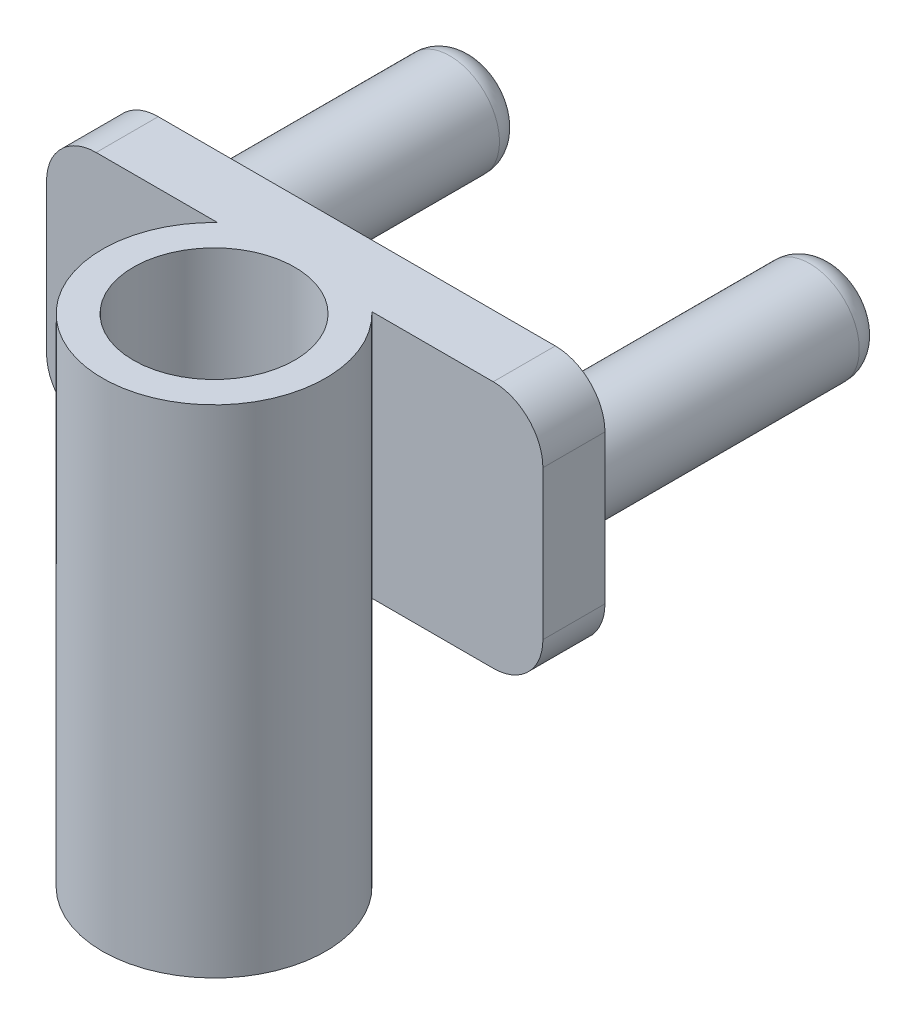
ISO-10303-21;
HEADER;
FILE_DESCRIPTION(('STEP AP214'),'2;1');
FILE_NAME('part.step','',(''),(''),'','','');
FILE_SCHEMA(('AUTOMOTIVE_DESIGN { 1 0 10303 214 1 1 1 1 }'));
ENDSEC;
DATA;
#1=APPLICATION_CONTEXT('core data for automotive mechanical design processes');
#2=APPLICATION_PROTOCOL_DEFINITION('international standard','automotive_design',2000,#1);
#3=PRODUCT_CONTEXT('',#1,'mechanical');
#4=PRODUCT('Part','Part','',(#3));
#5=PRODUCT_RELATED_PRODUCT_CATEGORY('part','',(#4));
#6=PRODUCT_DEFINITION_FORMATION('','',#4);
#7=PRODUCT_DEFINITION_CONTEXT('part definition',#1,'design');
#8=PRODUCT_DEFINITION('design','',#6,#7);
#9=PRODUCT_DEFINITION_SHAPE('','',#8);
#10=(LENGTH_UNIT() NAMED_UNIT(*) SI_UNIT(.MILLI.,.METRE.));
#11=(NAMED_UNIT(*) PLANE_ANGLE_UNIT() SI_UNIT($,.RADIAN.));
#12=(NAMED_UNIT(*) SI_UNIT($,.STERADIAN.) SOLID_ANGLE_UNIT());
#13=UNCERTAINTY_MEASURE_WITH_UNIT(LENGTH_MEASURE(1.E-05),#10,'distance_accuracy_value','');
#14=(GEOMETRIC_REPRESENTATION_CONTEXT(3) GLOBAL_UNCERTAINTY_ASSIGNED_CONTEXT((#13)) GLOBAL_UNIT_ASSIGNED_CONTEXT((#10,
#11,#12)) REPRESENTATION_CONTEXT('',''));
#15=CARTESIAN_POINT('',(0.,0.,0.));
#16=DIRECTION('',(0.,0.,1.));
#17=DIRECTION('',(1.,0.,0.));
#18=AXIS2_PLACEMENT_3D('',#15,#16,#17);
#19=CARTESIAN_POINT('',(0.,20.,0.));
#20=DIRECTION('',(0.,-1.,0.));
#21=DIRECTION('',(0.,0.,-1.));
#22=AXIS2_PLACEMENT_3D('',#19,#20,#21);
#23=CYLINDRICAL_SURFACE('',#22,4.5);
#24=CARTESIAN_POINT('',(0.,0.,0.));
#25=DIRECTION('',(0.,1.,0.));
#26=DIRECTION('',(0.,0.,1.));
#27=AXIS2_PLACEMENT_3D('',#24,#25,#26);
#28=CIRCLE('',#27,4.5);
#29=CARTESIAN_POINT('',(0.,0.,4.5));
#30=VERTEX_POINT('',#29);
#31=EDGE_CURVE('E137',#30,#30,#28,.T.);
#32=ORIENTED_EDGE('',*,*,#31,.T.);
#33=EDGE_LOOP('',(#32));
#34=FACE_BOUND('',#33,.T.);
#35=DIRECTION('',(0.,-1.,0.));
#36=VECTOR('',#35,1.);
#37=CARTESIAN_POINT('',(3.11247489949718,20.,-3.25));
#38=LINE('',#37,#36);
#39=CARTESIAN_POINT('',(3.11247489949718,20.,-3.25));
#40=VERTEX_POINT('',#39);
#41=CARTESIAN_POINT('',(3.11247489949718,10.,-3.25));
#42=VERTEX_POINT('',#41);
#43=EDGE_CURVE('E135',#40,#42,#38,.T.);
#44=ORIENTED_EDGE('',*,*,#43,.F.);
#45=CARTESIAN_POINT('',(0.,20.,0.));
#46=DIRECTION('',(0.,1.,0.));
#47=DIRECTION('',(0.,0.,1.));
#48=AXIS2_PLACEMENT_3D('',#45,#46,#47);
#49=CIRCLE('',#48,4.5);
#50=CARTESIAN_POINT('',(-3.11247489949718,20.,-3.25));
#51=VERTEX_POINT('',#50);
#52=EDGE_CURVE('E120',#51,#40,#49,.T.);
#53=ORIENTED_EDGE('',*,*,#52,.F.);
#54=DIRECTION('',(0.,-1.,0.));
#55=VECTOR('',#54,1.);
#56=CARTESIAN_POINT('',(-3.11247489949718,20.,-3.25));
#57=LINE('',#56,#55);
#58=CARTESIAN_POINT('',(-3.11247489949718,10.,-3.25));
#59=VERTEX_POINT('',#58);
#60=EDGE_CURVE('E132',#59,#51,#57,.F.);
#61=ORIENTED_EDGE('',*,*,#60,.F.);
#62=CARTESIAN_POINT('',(0.,10.,0.));
#63=DIRECTION('',(0.,1.,0.));
#64=DIRECTION('',(0.,0.,1.));
#65=AXIS2_PLACEMENT_3D('',#62,#63,#64);
#66=CIRCLE('',#65,4.5);
#67=EDGE_CURVE('E144',#42,#59,#66,.T.);
#68=ORIENTED_EDGE('',*,*,#67,.F.);
#69=EDGE_LOOP('',(#44,#53,#61,#68));
#70=FACE_BOUND('',#69,.T.);
#71=ADVANCED_FACE('F36',(#34,#70),#23,.T.);
#72=CARTESIAN_POINT('',(0.,20.,0.));
#73=DIRECTION('',(0.,1.,0.));
#74=DIRECTION('',(0.,0.,1.));
#75=AXIS2_PLACEMENT_3D('',#72,#73,#74);
#76=PLANE('',#75);
#77=CARTESIAN_POINT('',(0.,20.,0.));
#78=DIRECTION('',(0.,1.,0.));
#79=DIRECTION('',(0.,0.,1.));
#80=AXIS2_PLACEMENT_3D('',#77,#78,#79);
#81=CIRCLE('',#80,3.25);
#82=CARTESIAN_POINT('',(0.,20.,3.25));
#83=VERTEX_POINT('',#82);
#84=EDGE_CURVE('E153',#83,#83,#81,.T.);
#85=ORIENTED_EDGE('',*,*,#84,.F.);
#86=EDGE_LOOP('',(#85));
#87=FACE_BOUND('',#86,.T.);
#88=DIRECTION('',(1.,0.,0.));
#89=VECTOR('',#88,1.);
#90=CARTESIAN_POINT('',(-10.,20.,-5.75));
#91=LINE('',#90,#89);
#92=CARTESIAN_POINT('',(-8.,20.,-5.75));
#93=VERTEX_POINT('',#92);
#94=CARTESIAN_POINT('',(8.,20.,-5.75));
#95=VERTEX_POINT('',#94);
#96=EDGE_CURVE('E258',#93,#95,#91,.T.);
#97=ORIENTED_EDGE('',*,*,#96,.F.);
#98=DIRECTION('',(0.,0.,-1.));
#99=VECTOR('',#98,1.);
#100=CARTESIAN_POINT('',(-8.,20.,-3.25));
#101=LINE('',#100,#99);
#102=CARTESIAN_POINT('',(-8.,20.,-3.25));
#103=VERTEX_POINT('',#102);
#104=EDGE_CURVE('E123',#93,#103,#101,.F.);
#105=ORIENTED_EDGE('',*,*,#104,.T.);
#106=DIRECTION('',(1.,0.,0.));
#107=VECTOR('',#106,1.);
#108=CARTESIAN_POINT('',(-10.,20.,-3.25));
#109=LINE('',#108,#107);
#110=EDGE_CURVE('E115',#103,#51,#109,.T.);
#111=ORIENTED_EDGE('',*,*,#110,.T.);
#112=ORIENTED_EDGE('',*,*,#52,.T.);
#113=CARTESIAN_POINT('',(8.,20.,-3.25));
#114=VERTEX_POINT('',#113);
#115=EDGE_CURVE('E128',#40,#114,#109,.T.);
#116=ORIENTED_EDGE('',*,*,#115,.T.);
#117=DIRECTION('',(0.,0.,-1.));
#118=VECTOR('',#117,1.);
#119=CARTESIAN_POINT('',(8.,20.,0.));
#120=LINE('',#119,#118);
#121=EDGE_CURVE('E181',#114,#95,#120,.T.);
#122=ORIENTED_EDGE('',*,*,#121,.T.);
#123=EDGE_LOOP('',(#97,#105,#111,#112,#116,#122));
#124=FACE_BOUND('',#123,.T.);
#125=ADVANCED_FACE('F118',(#87,#124),#76,.T.);
#126=CARTESIAN_POINT('',(0.,0.,0.));
#127=DIRECTION('',(0.,1.,0.));
#128=DIRECTION('',(0.,0.,1.));
#129=AXIS2_PLACEMENT_3D('',#126,#127,#128);
#130=PLANE('',#129);
#131=ORIENTED_EDGE('',*,*,#31,.F.);
#132=EDGE_LOOP('',(#131));
#133=FACE_BOUND('',#132,.T.);
#134=CARTESIAN_POINT('',(0.,0.,0.));
#135=DIRECTION('',(0.,1.,0.));
#136=DIRECTION('',(0.,0.,1.));
#137=AXIS2_PLACEMENT_3D('',#134,#135,#136);
#138=CIRCLE('',#137,3.25);
#139=CARTESIAN_POINT('',(0.,0.,3.25));
#140=VERTEX_POINT('',#139);
#141=EDGE_CURVE('E152',#140,#140,#138,.T.);
#142=ORIENTED_EDGE('',*,*,#141,.T.);
#143=EDGE_LOOP('',(#142));
#144=FACE_BOUND('',#143,.T.);
#145=ADVANCED_FACE('F217',(#133,#144),#130,.F.);
#146=CARTESIAN_POINT('',(0.,20.,0.));
#147=DIRECTION('',(0.,-1.,0.));
#148=DIRECTION('',(0.,0.,-1.));
#149=AXIS2_PLACEMENT_3D('',#146,#147,#148);
#150=CYLINDRICAL_SURFACE('',#149,3.25);
#151=ORIENTED_EDGE('',*,*,#84,.T.);
#152=EDGE_LOOP('',(#151));
#153=FACE_BOUND('',#152,.T.);
#154=ORIENTED_EDGE('',*,*,#141,.F.);
#155=EDGE_LOOP('',(#154));
#156=FACE_BOUND('',#155,.T.);
#157=ADVANCED_FACE('F296',(#153,#156),#150,.F.);
#158=CARTESIAN_POINT('',(0.,0.,-3.25));
#159=DIRECTION('',(0.,0.,-1.));
#160=DIRECTION('',(-1.,0.,0.));
#161=AXIS2_PLACEMENT_3D('',#158,#159,#160);
#162=PLANE('',#161);
#163=DIRECTION('',(1.,0.,0.));
#164=VECTOR('',#163,1.);
#165=CARTESIAN_POINT('',(-10.,10.,-3.25));
#166=LINE('',#165,#164);
#167=CARTESIAN_POINT('',(8.,10.,-3.25));
#168=VERTEX_POINT('',#167);
#169=EDGE_CURVE('E261',#42,#168,#166,.T.);
#170=ORIENTED_EDGE('',*,*,#169,.T.);
#171=CARTESIAN_POINT('',(8.,12.,-3.25));
#172=DIRECTION('',(0.,0.,-1.));
#173=DIRECTION('',(-1.,0.,0.));
#174=AXIS2_PLACEMENT_3D('',#171,#172,#173);
#175=CIRCLE('',#174,2.);
#176=CARTESIAN_POINT('',(10.,12.,-3.25));
#177=VERTEX_POINT('',#176);
#178=EDGE_CURVE('E51',#168,#177,#175,.F.);
#179=ORIENTED_EDGE('',*,*,#178,.T.);
#180=DIRECTION('',(0.,-1.,0.));
#181=VECTOR('',#180,1.);
#182=CARTESIAN_POINT('',(10.,20.,-3.25));
#183=LINE('',#182,#181);
#184=CARTESIAN_POINT('',(10.,18.,-3.25));
#185=VERTEX_POINT('',#184);
#186=EDGE_CURVE('E247',#185,#177,#183,.T.);
#187=ORIENTED_EDGE('',*,*,#186,.F.);
#188=CARTESIAN_POINT('',(8.,18.,-3.25));
#189=DIRECTION('',(0.,0.,-1.));
#190=DIRECTION('',(-1.,0.,0.));
#191=AXIS2_PLACEMENT_3D('',#188,#189,#190);
#192=CIRCLE('',#191,2.);
#193=EDGE_CURVE('E189',#185,#114,#192,.F.);
#194=ORIENTED_EDGE('',*,*,#193,.T.);
#195=ORIENTED_EDGE('',*,*,#115,.F.);
#196=ORIENTED_EDGE('',*,*,#43,.T.);
#197=EDGE_LOOP('',(#170,#179,#187,#194,#195,#196));
#198=FACE_BOUND('',#197,.T.);
#199=ADVANCED_FACE('F246',(#198),#162,.F.);
#200=DIRECTION('',(0.,-1.,0.));
#201=VECTOR('',#200,1.);
#202=CARTESIAN_POINT('',(-10.,20.,-3.25));
#203=LINE('',#202,#201);
#204=CARTESIAN_POINT('',(-10.,18.,-3.25));
#205=VERTEX_POINT('',#204);
#206=CARTESIAN_POINT('',(-10.,12.,-3.25));
#207=VERTEX_POINT('',#206);
#208=EDGE_CURVE('E127',#205,#207,#203,.T.);
#209=ORIENTED_EDGE('',*,*,#208,.T.);
#210=CARTESIAN_POINT('',(-8.,12.,-3.25));
#211=DIRECTION('',(0.,0.,-1.));
#212=DIRECTION('',(-1.,0.,0.));
#213=AXIS2_PLACEMENT_3D('',#210,#211,#212);
#214=CIRCLE('',#213,2.);
#215=CARTESIAN_POINT('',(-8.,10.,-3.25));
#216=VERTEX_POINT('',#215);
#217=EDGE_CURVE('E179',#207,#216,#214,.F.);
#218=ORIENTED_EDGE('',*,*,#217,.T.);
#219=EDGE_CURVE('E142',#216,#59,#166,.T.);
#220=ORIENTED_EDGE('',*,*,#219,.T.);
#221=ORIENTED_EDGE('',*,*,#60,.T.);
#222=ORIENTED_EDGE('',*,*,#110,.F.);
#223=CARTESIAN_POINT('',(-8.,18.,-3.25));
#224=DIRECTION('',(0.,0.,-1.));
#225=DIRECTION('',(-1.,0.,0.));
#226=AXIS2_PLACEMENT_3D('',#223,#224,#225);
#227=CIRCLE('',#226,2.);
#228=EDGE_CURVE('E177',#103,#205,#227,.F.);
#229=ORIENTED_EDGE('',*,*,#228,.T.);
#230=EDGE_LOOP('',(#209,#218,#220,#221,#222,#229));
#231=FACE_BOUND('',#230,.T.);
#232=ADVANCED_FACE('F140',(#231),#162,.F.);
#233=CARTESIAN_POINT('',(-10.,10.,-3.25));
#234=DIRECTION('',(0.,1.,0.));
#235=DIRECTION('',(0.,0.,1.));
#236=AXIS2_PLACEMENT_3D('',#233,#234,#235);
#237=PLANE('',#236);
#238=ORIENTED_EDGE('',*,*,#219,.F.);
#239=DIRECTION('',(0.,0.,-1.));
#240=VECTOR('',#239,1.);
#241=CARTESIAN_POINT('',(-8.,10.,-3.25));
#242=LINE('',#241,#240);
#243=CARTESIAN_POINT('',(-8.,10.,-5.75));
#244=VERTEX_POINT('',#243);
#245=EDGE_CURVE('E161',#216,#244,#242,.T.);
#246=ORIENTED_EDGE('',*,*,#245,.T.);
#247=DIRECTION('',(1.,0.,0.));
#248=VECTOR('',#247,1.);
#249=CARTESIAN_POINT('',(-10.,10.,-5.75));
#250=LINE('',#249,#248);
#251=CARTESIAN_POINT('',(8.,10.,-5.75));
#252=VERTEX_POINT('',#251);
#253=EDGE_CURVE('E252',#244,#252,#250,.T.);
#254=ORIENTED_EDGE('',*,*,#253,.T.);
#255=DIRECTION('',(0.,0.,-1.));
#256=VECTOR('',#255,1.);
#257=CARTESIAN_POINT('',(8.,10.,-3.25));
#258=LINE('',#257,#256);
#259=EDGE_CURVE('E136',#252,#168,#258,.F.);
#260=ORIENTED_EDGE('',*,*,#259,.T.);
#261=ORIENTED_EDGE('',*,*,#169,.F.);
#262=ORIENTED_EDGE('',*,*,#67,.T.);
#263=EDGE_LOOP('',(#238,#246,#254,#260,#261,#262));
#264=FACE_BOUND('',#263,.T.);
#265=ADVANCED_FACE('F283',(#264),#237,.F.);
#266=CARTESIAN_POINT('',(10.,20.,-3.25));
#267=DIRECTION('',(1.,0.,0.));
#268=DIRECTION('',(0.,0.,-1.));
#269=AXIS2_PLACEMENT_3D('',#266,#267,#268);
#270=PLANE('',#269);
#271=ORIENTED_EDGE('',*,*,#186,.T.);
#272=DIRECTION('',(0.,0.,-1.));
#273=VECTOR('',#272,1.);
#274=CARTESIAN_POINT('',(10.,12.,-5.75));
#275=LINE('',#274,#273);
#276=CARTESIAN_POINT('',(10.,12.,-5.75));
#277=VERTEX_POINT('',#276);
#278=EDGE_CURVE('E186',#177,#277,#275,.T.);
#279=ORIENTED_EDGE('',*,*,#278,.T.);
#280=DIRECTION('',(0.,-1.,0.));
#281=VECTOR('',#280,1.);
#282=CARTESIAN_POINT('',(10.,20.,-5.75));
#283=LINE('',#282,#281);
#284=CARTESIAN_POINT('',(10.,18.,-5.75));
#285=VERTEX_POINT('',#284);
#286=EDGE_CURVE('E255',#285,#277,#283,.T.);
#287=ORIENTED_EDGE('',*,*,#286,.F.);
#288=DIRECTION('',(0.,0.,-1.));
#289=VECTOR('',#288,1.);
#290=CARTESIAN_POINT('',(10.,18.,-3.25));
#291=LINE('',#290,#289);
#292=EDGE_CURVE('E58',#285,#185,#291,.F.);
#293=ORIENTED_EDGE('',*,*,#292,.T.);
#294=EDGE_LOOP('',(#271,#279,#287,#293));
#295=FACE_BOUND('',#294,.T.);
#296=ADVANCED_FACE('F286',(#295),#270,.T.);
#297=CARTESIAN_POINT('',(-10.,20.,-3.25));
#298=DIRECTION('',(1.,0.,0.));
#299=DIRECTION('',(0.,0.,-1.));
#300=AXIS2_PLACEMENT_3D('',#297,#298,#299);
#301=PLANE('',#300);
#302=DIRECTION('',(0.,-1.,0.));
#303=VECTOR('',#302,1.);
#304=CARTESIAN_POINT('',(-10.,20.,-5.75));
#305=LINE('',#304,#303);
#306=CARTESIAN_POINT('',(-10.,18.,-5.75));
#307=VERTEX_POINT('',#306);
#308=CARTESIAN_POINT('',(-10.,12.,-5.75));
#309=VERTEX_POINT('',#308);
#310=EDGE_CURVE('E148',#307,#309,#305,.T.);
#311=ORIENTED_EDGE('',*,*,#310,.T.);
#312=DIRECTION('',(0.,0.,-1.));
#313=VECTOR('',#312,1.);
#314=CARTESIAN_POINT('',(-10.,12.,-3.25));
#315=LINE('',#314,#313);
#316=EDGE_CURVE('E175',#309,#207,#315,.F.);
#317=ORIENTED_EDGE('',*,*,#316,.T.);
#318=ORIENTED_EDGE('',*,*,#208,.F.);
#319=DIRECTION('',(0.,0.,-1.));
#320=VECTOR('',#319,1.);
#321=CARTESIAN_POINT('',(-10.,18.,-5.75));
#322=LINE('',#321,#320);
#323=EDGE_CURVE('E172',#205,#307,#322,.T.);
#324=ORIENTED_EDGE('',*,*,#323,.T.);
#325=EDGE_LOOP('',(#311,#317,#318,#324));
#326=FACE_BOUND('',#325,.T.);
#327=ADVANCED_FACE('F277',(#326),#301,.F.);
#328=CARTESIAN_POINT('',(0.,0.,-5.75));
#329=DIRECTION('',(0.,0.,-1.));
#330=DIRECTION('',(-1.,0.,0.));
#331=AXIS2_PLACEMENT_3D('',#328,#329,#330);
#332=PLANE('',#331);
#333=CARTESIAN_POINT('',(-7.25,15.,-5.75));
#334=DIRECTION('',(0.,0.,-1.));
#335=DIRECTION('',(-1.,0.,0.));
#336=AXIS2_PLACEMENT_3D('',#333,#334,#335);
#337=CIRCLE('',#336,2.);
#338=CARTESIAN_POINT('',(-9.25,15.,-5.75));
#339=VERTEX_POINT('',#338);
#340=EDGE_CURVE('E269',#339,#339,#337,.T.);
#341=ORIENTED_EDGE('',*,*,#340,.F.);
#342=EDGE_LOOP('',(#341));
#343=FACE_BOUND('',#342,.T.);
#344=CARTESIAN_POINT('',(7.25,15.,-5.75));
#345=DIRECTION('',(0.,0.,-1.));
#346=DIRECTION('',(-1.,0.,0.));
#347=AXIS2_PLACEMENT_3D('',#344,#345,#346);
#348=CIRCLE('',#347,2.);
#349=CARTESIAN_POINT('',(5.25,15.,-5.75));
#350=VERTEX_POINT('',#349);
#351=EDGE_CURVE('E256',#350,#350,#348,.T.);
#352=ORIENTED_EDGE('',*,*,#351,.F.);
#353=EDGE_LOOP('',(#352));
#354=FACE_BOUND('',#353,.T.);
#355=ORIENTED_EDGE('',*,*,#253,.F.);
#356=CARTESIAN_POINT('',(-8.,12.,-5.75));
#357=DIRECTION('',(0.,0.,-1.));
#358=DIRECTION('',(-1.,0.,0.));
#359=AXIS2_PLACEMENT_3D('',#356,#357,#358);
#360=CIRCLE('',#359,2.);
#361=EDGE_CURVE('E170',#244,#309,#360,.T.);
#362=ORIENTED_EDGE('',*,*,#361,.T.);
#363=ORIENTED_EDGE('',*,*,#310,.F.);
#364=CARTESIAN_POINT('',(-8.,18.,-5.75));
#365=DIRECTION('',(0.,0.,-1.));
#366=DIRECTION('',(-1.,0.,0.));
#367=AXIS2_PLACEMENT_3D('',#364,#365,#366);
#368=CIRCLE('',#367,2.);
#369=EDGE_CURVE('E168',#307,#93,#368,.T.);
#370=ORIENTED_EDGE('',*,*,#369,.T.);
#371=ORIENTED_EDGE('',*,*,#96,.T.);
#372=CARTESIAN_POINT('',(8.,18.,-5.75));
#373=DIRECTION('',(0.,0.,-1.));
#374=DIRECTION('',(-1.,0.,0.));
#375=AXIS2_PLACEMENT_3D('',#372,#373,#374);
#376=CIRCLE('',#375,2.);
#377=EDGE_CURVE('E164',#95,#285,#376,.T.);
#378=ORIENTED_EDGE('',*,*,#377,.T.);
#379=ORIENTED_EDGE('',*,*,#286,.T.);
#380=CARTESIAN_POINT('',(8.,12.,-5.75));
#381=DIRECTION('',(0.,0.,-1.));
#382=DIRECTION('',(-1.,0.,0.));
#383=AXIS2_PLACEMENT_3D('',#380,#381,#382);
#384=CIRCLE('',#383,2.);
#385=EDGE_CURVE('E166',#277,#252,#384,.T.);
#386=ORIENTED_EDGE('',*,*,#385,.T.);
#387=EDGE_LOOP('',(#355,#362,#363,#370,#371,#378,#379,#386));
#388=FACE_BOUND('',#387,.T.);
#389=ADVANCED_FACE('F226',(#343,#354,#388),#332,.T.);
#390=CARTESIAN_POINT('',(-8.,12.,-3.25));
#391=DIRECTION('',(0.,0.,-1.));
#392=DIRECTION('',(-1.,0.,0.));
#393=AXIS2_PLACEMENT_3D('',#390,#391,#392);
#394=CYLINDRICAL_SURFACE('',#393,2.);
#395=ORIENTED_EDGE('',*,*,#217,.F.);
#396=ORIENTED_EDGE('',*,*,#316,.F.);
#397=ORIENTED_EDGE('',*,*,#361,.F.);
#398=ORIENTED_EDGE('',*,*,#245,.F.);
#399=EDGE_LOOP('',(#395,#396,#397,#398));
#400=FACE_BOUND('',#399,.T.);
#401=ADVANCED_FACE('F222',(#400),#394,.T.);
#402=CARTESIAN_POINT('',(-8.,18.,-3.25));
#403=DIRECTION('',(0.,0.,1.));
#404=DIRECTION('',(1.,0.,0.));
#405=AXIS2_PLACEMENT_3D('',#402,#403,#404);
#406=CYLINDRICAL_SURFACE('',#405,2.);
#407=ORIENTED_EDGE('',*,*,#228,.F.);
#408=ORIENTED_EDGE('',*,*,#104,.F.);
#409=ORIENTED_EDGE('',*,*,#369,.F.);
#410=ORIENTED_EDGE('',*,*,#323,.F.);
#411=EDGE_LOOP('',(#407,#408,#409,#410));
#412=FACE_BOUND('',#411,.T.);
#413=ADVANCED_FACE('F225',(#412),#406,.T.);
#414=CARTESIAN_POINT('',(8.,12.,-3.25));
#415=DIRECTION('',(0.,0.,1.));
#416=DIRECTION('',(1.,0.,0.));
#417=AXIS2_PLACEMENT_3D('',#414,#415,#416);
#418=CYLINDRICAL_SURFACE('',#417,2.);
#419=ORIENTED_EDGE('',*,*,#178,.F.);
#420=ORIENTED_EDGE('',*,*,#259,.F.);
#421=ORIENTED_EDGE('',*,*,#385,.F.);
#422=ORIENTED_EDGE('',*,*,#278,.F.);
#423=EDGE_LOOP('',(#419,#420,#421,#422));
#424=FACE_BOUND('',#423,.T.);
#425=ADVANCED_FACE('F230',(#424),#418,.T.);
#426=CARTESIAN_POINT('',(8.,18.,0.));
#427=DIRECTION('',(0.,0.,-1.));
#428=DIRECTION('',(-1.,0.,0.));
#429=AXIS2_PLACEMENT_3D('',#426,#427,#428);
#430=CYLINDRICAL_SURFACE('',#429,2.);
#431=ORIENTED_EDGE('',*,*,#193,.F.);
#432=ORIENTED_EDGE('',*,*,#292,.F.);
#433=ORIENTED_EDGE('',*,*,#377,.F.);
#434=ORIENTED_EDGE('',*,*,#121,.F.);
#435=EDGE_LOOP('',(#431,#432,#433,#434));
#436=FACE_BOUND('',#435,.T.);
#437=ADVANCED_FACE('F234',(#436),#430,.T.);
#438=CARTESIAN_POINT('',(7.25,15.,-17.75));
#439=DIRECTION('',(0.,0.,1.));
#440=DIRECTION('',(1.,0.,0.));
#441=AXIS2_PLACEMENT_3D('',#438,#439,#440);
#442=CYLINDRICAL_SURFACE('',#441,2.);
#443=CARTESIAN_POINT('',(7.25,15.,-16.75));
#444=DIRECTION('',(0.,0.,-1.));
#445=DIRECTION('',(-1.,0.,0.));
#446=AXIS2_PLACEMENT_3D('',#443,#444,#445);
#447=CIRCLE('',#446,2.);
#448=CARTESIAN_POINT('',(5.25,15.,-16.75));
#449=VERTEX_POINT('',#448);
#450=EDGE_CURVE('E11',#449,#449,#447,.F.);
#451=ORIENTED_EDGE('',*,*,#450,.T.);
#452=EDGE_LOOP('',(#451));
#453=FACE_BOUND('',#452,.T.);
#454=ORIENTED_EDGE('',*,*,#351,.T.);
#455=EDGE_LOOP('',(#454));
#456=FACE_BOUND('',#455,.T.);
#457=ADVANCED_FACE('F237',(#453,#456),#442,.T.);
#458=CARTESIAN_POINT('',(7.25,15.,-17.75));
#459=DIRECTION('',(0.,0.,-1.));
#460=DIRECTION('',(-1.,0.,0.));
#461=AXIS2_PLACEMENT_3D('',#458,#459,#460);
#462=PLANE('',#461);
#463=CARTESIAN_POINT('',(7.25,15.,-17.75));
#464=DIRECTION('',(0.,0.,-1.));
#465=DIRECTION('',(-1.,0.,0.));
#466=AXIS2_PLACEMENT_3D('',#463,#464,#465);
#467=CIRCLE('',#466,1.);
#468=CARTESIAN_POINT('',(6.25,15.,-17.75));
#469=VERTEX_POINT('',#468);
#470=EDGE_CURVE('E44',#469,#469,#467,.T.);
#471=ORIENTED_EDGE('',*,*,#470,.T.);
#472=EDGE_LOOP('',(#471));
#473=FACE_BOUND('',#472,.T.);
#474=ADVANCED_FACE('F200',(#473),#462,.T.);
#475=CARTESIAN_POINT('',(-7.25,15.,-17.75));
#476=DIRECTION('',(0.,0.,1.));
#477=DIRECTION('',(1.,0.,0.));
#478=AXIS2_PLACEMENT_3D('',#475,#476,#477);
#479=CYLINDRICAL_SURFACE('',#478,2.);
#480=CARTESIAN_POINT('',(-7.25,15.,-16.75));
#481=DIRECTION('',(0.,0.,-1.));
#482=DIRECTION('',(-1.,0.,0.));
#483=AXIS2_PLACEMENT_3D('',#480,#481,#482);
#484=CIRCLE('',#483,2.);
#485=CARTESIAN_POINT('',(-9.25,15.,-16.75));
#486=VERTEX_POINT('',#485);
#487=EDGE_CURVE('E195',#486,#486,#484,.F.);
#488=ORIENTED_EDGE('',*,*,#487,.T.);
#489=EDGE_LOOP('',(#488));
#490=FACE_BOUND('',#489,.T.);
#491=ORIENTED_EDGE('',*,*,#340,.T.);
#492=EDGE_LOOP('',(#491));
#493=FACE_BOUND('',#492,.T.);
#494=ADVANCED_FACE('F273',(#490,#493),#479,.T.);
#495=CARTESIAN_POINT('',(-7.25,15.,-17.75));
#496=DIRECTION('',(0.,0.,-1.));
#497=DIRECTION('',(-1.,0.,0.));
#498=AXIS2_PLACEMENT_3D('',#495,#496,#497);
#499=PLANE('',#498);
#500=CARTESIAN_POINT('',(-7.25,15.,-17.75));
#501=DIRECTION('',(0.,0.,-1.));
#502=DIRECTION('',(-1.,0.,0.));
#503=AXIS2_PLACEMENT_3D('',#500,#501,#502);
#504=CIRCLE('',#503,1.);
#505=CARTESIAN_POINT('',(-8.25,15.,-17.75));
#506=VERTEX_POINT('',#505);
#507=EDGE_CURVE('E192',#506,#506,#504,.T.);
#508=ORIENTED_EDGE('',*,*,#507,.T.);
#509=EDGE_LOOP('',(#508));
#510=FACE_BOUND('',#509,.T.);
#511=ADVANCED_FACE('F208',(#510),#499,.T.);
#512=CARTESIAN_POINT('',(-7.25,15.,-16.75));
#513=DIRECTION('',(0.,0.,-1.));
#514=DIRECTION('',(-1.,0.,0.));
#515=AXIS2_PLACEMENT_3D('',#512,#513,#514);
#516=TOROIDAL_SURFACE('',#515,1.,1.);
#517=ORIENTED_EDGE('',*,*,#487,.F.);
#518=EDGE_LOOP('',(#517));
#519=FACE_BOUND('',#518,.T.);
#520=ORIENTED_EDGE('',*,*,#507,.F.);
#521=EDGE_LOOP('',(#520));
#522=FACE_BOUND('',#521,.T.);
#523=ADVANCED_FACE('F203',(#519,#522),#516,.T.);
#524=CARTESIAN_POINT('',(7.25,15.,-16.75));
#525=DIRECTION('',(0.,0.,-1.));
#526=DIRECTION('',(-1.,0.,0.));
#527=AXIS2_PLACEMENT_3D('',#524,#525,#526);
#528=TOROIDAL_SURFACE('',#527,1.,1.);
#529=ORIENTED_EDGE('',*,*,#450,.F.);
#530=EDGE_LOOP('',(#529));
#531=FACE_BOUND('',#530,.T.);
#532=ORIENTED_EDGE('',*,*,#470,.F.);
#533=EDGE_LOOP('',(#532));
#534=FACE_BOUND('',#533,.T.);
#535=ADVANCED_FACE('F38',(#531,#534),#528,.T.);
#536=CLOSED_SHELL('',(#71,#125,#145,#157,#199,#232,#265,#296,#327,#389,#401,#413,#425,#437,#457,
#474,#494,#511,#523,#535));
#537=MANIFOLD_SOLID_BREP('B2',#536);
#538=ADVANCED_BREP_SHAPE_REPRESENTATION('',(#18,#537),#14);
#539=SHAPE_DEFINITION_REPRESENTATION(#9,#538);
ENDSEC;
END-ISO-10303-21;
